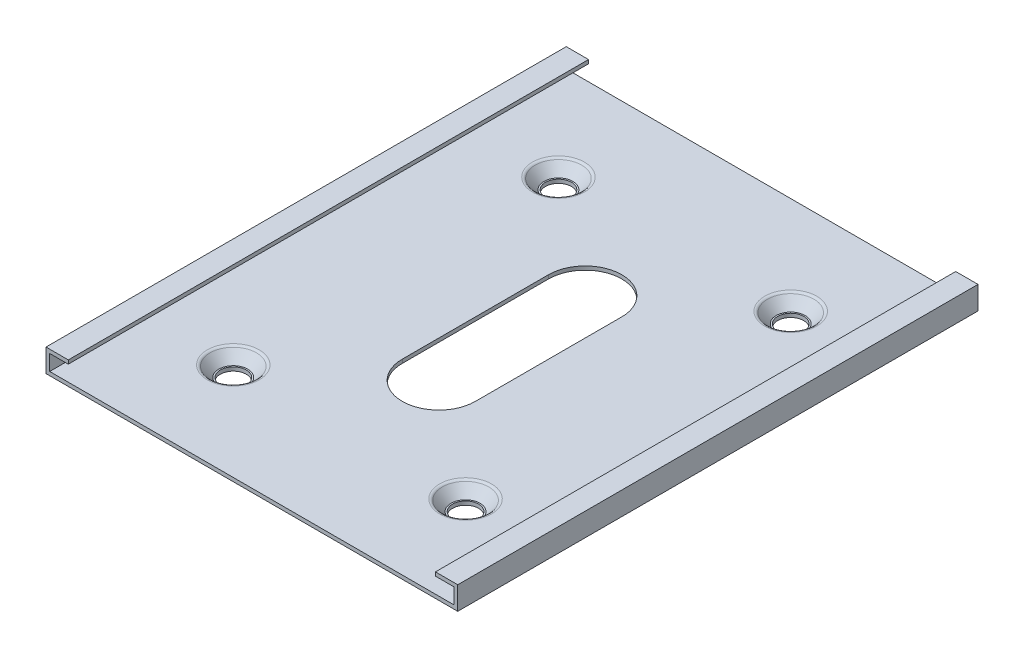
ISO-10303-21;
HEADER;
FILE_DESCRIPTION(('STEP AP214'),'2;1');
FILE_NAME('part.step','',(''),(''),'','','');
FILE_SCHEMA(('AUTOMOTIVE_DESIGN { 1 0 10303 214 1 1 1 1 }'));
ENDSEC;
DATA;
#1=APPLICATION_CONTEXT('core data for automotive mechanical design processes');
#2=APPLICATION_PROTOCOL_DEFINITION('international standard','automotive_design',2000,#1);
#3=PRODUCT_CONTEXT('',#1,'mechanical');
#4=PRODUCT('Part','Part','',(#3));
#5=PRODUCT_RELATED_PRODUCT_CATEGORY('part','',(#4));
#6=PRODUCT_DEFINITION_FORMATION('','',#4);
#7=PRODUCT_DEFINITION_CONTEXT('part definition',#1,'design');
#8=PRODUCT_DEFINITION('design','',#6,#7);
#9=PRODUCT_DEFINITION_SHAPE('','',#8);
#10=(LENGTH_UNIT() NAMED_UNIT(*) SI_UNIT(.MILLI.,.METRE.));
#11=(NAMED_UNIT(*) PLANE_ANGLE_UNIT() SI_UNIT($,.RADIAN.));
#12=(NAMED_UNIT(*) SI_UNIT($,.STERADIAN.) SOLID_ANGLE_UNIT());
#13=UNCERTAINTY_MEASURE_WITH_UNIT(LENGTH_MEASURE(1.E-05),#10,'distance_accuracy_value','');
#14=(GEOMETRIC_REPRESENTATION_CONTEXT(3) GLOBAL_UNCERTAINTY_ASSIGNED_CONTEXT((#13)) GLOBAL_UNIT_ASSIGNED_CONTEXT((#10,
#11,#12)) REPRESENTATION_CONTEXT('',''));
#15=CARTESIAN_POINT('',(0.,0.,0.));
#16=DIRECTION('',(0.,0.,1.));
#17=DIRECTION('',(1.,0.,0.));
#18=AXIS2_PLACEMENT_3D('',#15,#16,#17);
#19=CARTESIAN_POINT('',(-27.6352,2.13359999999999,35.56));
#20=DIRECTION('',(0.,1.,0.));
#21=DIRECTION('',(0.,0.,1.));
#22=AXIS2_PLACEMENT_3D('',#19,#20,#21);
#23=PLANE('',#22);
#24=DIRECTION('',(1.,0.,0.));
#25=VECTOR('',#24,1.);
#26=CARTESIAN_POINT('',(-27.6352,2.13359999999999,-35.56));
#27=LINE('',#26,#25);
#28=CARTESIAN_POINT('',(-27.6352,2.13359999999999,-35.56));
#29=VERTEX_POINT('',#28);
#30=CARTESIAN_POINT('',(-25.0952,2.13359999999999,-35.56));
#31=VERTEX_POINT('',#30);
#32=EDGE_CURVE('E173',#29,#31,#27,.T.);
#33=ORIENTED_EDGE('',*,*,#32,.T.);
#34=DIRECTION('',(0.,0.,-1.));
#35=VECTOR('',#34,1.);
#36=CARTESIAN_POINT('',(-25.0952,2.13359999999999,35.56));
#37=LINE('',#36,#35);
#38=CARTESIAN_POINT('',(-25.0952,2.13359999999999,35.56));
#39=VERTEX_POINT('',#38);
#40=EDGE_CURVE('E230',#39,#31,#37,.T.);
#41=ORIENTED_EDGE('',*,*,#40,.F.);
#42=DIRECTION('',(1.,0.,0.));
#43=VECTOR('',#42,1.);
#44=CARTESIAN_POINT('',(-27.6352,2.13359999999999,35.56));
#45=LINE('',#44,#43);
#46=CARTESIAN_POINT('',(-27.6352,2.13359999999999,35.56));
#47=VERTEX_POINT('',#46);
#48=EDGE_CURVE('E168',#47,#39,#45,.T.);
#49=ORIENTED_EDGE('',*,*,#48,.F.);
#50=DIRECTION('',(0.,0.,-1.));
#51=VECTOR('',#50,1.);
#52=CARTESIAN_POINT('',(-27.6352,2.13359999999999,35.56));
#53=LINE('',#52,#51);
#54=EDGE_CURVE('E163',#47,#29,#53,.T.);
#55=ORIENTED_EDGE('',*,*,#54,.T.);
#56=EDGE_LOOP('',(#33,#41,#49,#55));
#57=FACE_BOUND('',#56,.T.);
#58=ADVANCED_FACE('F33',(#57),#23,.F.);
#59=CARTESIAN_POINT('',(-25.0952,2.64159999999999,35.56));
#60=DIRECTION('',(1.,0.,0.));
#61=DIRECTION('',(0.,0.,-1.));
#62=AXIS2_PLACEMENT_3D('',#59,#60,#61);
#63=PLANE('',#62);
#64=DIRECTION('',(0.,-1.,0.));
#65=VECTOR('',#64,1.);
#66=CARTESIAN_POINT('',(-25.0952,2.64159999999999,-35.56));
#67=LINE('',#66,#65);
#68=CARTESIAN_POINT('',(-25.0952,2.64159999999999,-35.56));
#69=VERTEX_POINT('',#68);
#70=EDGE_CURVE('E180',#69,#31,#67,.T.);
#71=ORIENTED_EDGE('',*,*,#70,.F.);
#72=DIRECTION('',(0.,0.,-1.));
#73=VECTOR('',#72,1.);
#74=CARTESIAN_POINT('',(-25.0952,2.64159999999999,35.56));
#75=LINE('',#74,#73);
#76=CARTESIAN_POINT('',(-25.0952,2.64159999999999,35.56));
#77=VERTEX_POINT('',#76);
#78=EDGE_CURVE('E228',#77,#69,#75,.T.);
#79=ORIENTED_EDGE('',*,*,#78,.F.);
#80=DIRECTION('',(0.,-1.,0.));
#81=VECTOR('',#80,1.);
#82=CARTESIAN_POINT('',(-25.0952,2.64159999999999,35.56));
#83=LINE('',#82,#81);
#84=EDGE_CURVE('E319',#77,#39,#83,.T.);
#85=ORIENTED_EDGE('',*,*,#84,.T.);
#86=ORIENTED_EDGE('',*,*,#40,.T.);
#87=EDGE_LOOP('',(#71,#79,#85,#86));
#88=FACE_BOUND('',#87,.T.);
#89=ADVANCED_FACE('F350',(#88),#63,.T.);
#90=CARTESIAN_POINT('',(-27.6352,2.64159999999999,35.56));
#91=DIRECTION('',(0.,1.,0.));
#92=DIRECTION('',(0.,0.,1.));
#93=AXIS2_PLACEMENT_3D('',#90,#91,#92);
#94=PLANE('',#93);
#95=DIRECTION('',(1.,0.,0.));
#96=VECTOR('',#95,1.);
#97=CARTESIAN_POINT('',(-27.6352,2.64159999999999,-35.56));
#98=LINE('',#97,#96);
#99=CARTESIAN_POINT('',(-28.1432,2.64159999999999,-35.56));
#100=VERTEX_POINT('',#99);
#101=EDGE_CURVE('E183',#100,#69,#98,.T.);
#102=ORIENTED_EDGE('',*,*,#101,.F.);
#103=DIRECTION('',(0.,0.,-1.));
#104=VECTOR('',#103,1.);
#105=CARTESIAN_POINT('',(-28.1432,2.64159999999999,35.56));
#106=LINE('',#105,#104);
#107=CARTESIAN_POINT('',(-28.1432,2.64159999999999,35.56));
#108=VERTEX_POINT('',#107);
#109=EDGE_CURVE('E226',#108,#100,#106,.T.);
#110=ORIENTED_EDGE('',*,*,#109,.F.);
#111=DIRECTION('',(1.,0.,0.));
#112=VECTOR('',#111,1.);
#113=CARTESIAN_POINT('',(-27.6352,2.64159999999999,35.56));
#114=LINE('',#113,#112);
#115=EDGE_CURVE('E322',#108,#77,#114,.T.);
#116=ORIENTED_EDGE('',*,*,#115,.T.);
#117=ORIENTED_EDGE('',*,*,#78,.T.);
#118=EDGE_LOOP('',(#102,#110,#116,#117));
#119=FACE_BOUND('',#118,.T.);
#120=ADVANCED_FACE('F353',(#119),#94,.T.);
#121=CARTESIAN_POINT('',(-28.1432,0.,35.56));
#122=DIRECTION('',(-1.,0.,0.));
#123=DIRECTION('',(0.,0.,1.));
#124=AXIS2_PLACEMENT_3D('',#121,#122,#123);
#125=PLANE('',#124);
#126=DIRECTION('',(0.,1.,0.));
#127=VECTOR('',#126,1.);
#128=CARTESIAN_POINT('',(-28.1432,0.,-35.56));
#129=LINE('',#128,#127);
#130=CARTESIAN_POINT('',(-28.1432,-0.508,-35.56));
#131=VERTEX_POINT('',#130);
#132=EDGE_CURVE('E190',#131,#100,#129,.T.);
#133=ORIENTED_EDGE('',*,*,#132,.F.);
#134=DIRECTION('',(0.,0.,-1.));
#135=VECTOR('',#134,1.);
#136=CARTESIAN_POINT('',(-28.1432,-0.508,35.56));
#137=LINE('',#136,#135);
#138=CARTESIAN_POINT('',(-28.1432,-0.508,35.56));
#139=VERTEX_POINT('',#138);
#140=EDGE_CURVE('E224',#139,#131,#137,.T.);
#141=ORIENTED_EDGE('',*,*,#140,.F.);
#142=DIRECTION('',(0.,1.,0.));
#143=VECTOR('',#142,1.);
#144=CARTESIAN_POINT('',(-28.1432,0.,35.56));
#145=LINE('',#144,#143);
#146=EDGE_CURVE('E325',#139,#108,#145,.T.);
#147=ORIENTED_EDGE('',*,*,#146,.T.);
#148=ORIENTED_EDGE('',*,*,#109,.T.);
#149=EDGE_LOOP('',(#133,#141,#147,#148));
#150=FACE_BOUND('',#149,.T.);
#151=ADVANCED_FACE('F358',(#150),#125,.T.);
#152=CARTESIAN_POINT('',(27.6352,-0.508,35.56));
#153=DIRECTION('',(0.,-1.,0.));
#154=DIRECTION('',(0.,0.,-1.));
#155=AXIS2_PLACEMENT_3D('',#152,#153,#154);
#156=PLANE('',#155);
#157=CARTESIAN_POINT('',(15.875,-0.508,22.225));
#158=DIRECTION('',(0.,-1.,0.));
#159=DIRECTION('',(0.,0.,-1.));
#160=AXIS2_PLACEMENT_3D('',#157,#158,#159);
#161=CIRCLE('',#160,3.72761304322479);
#162=CARTESIAN_POINT('',(15.875,-0.508,18.4973869567752));
#163=VERTEX_POINT('',#162);
#164=EDGE_CURVE('E254',#163,#163,#161,.F.);
#165=ORIENTED_EDGE('',*,*,#164,.T.);
#166=EDGE_LOOP('',(#165));
#167=FACE_BOUND('',#166,.T.);
#168=CARTESIAN_POINT('',(-15.875,-0.508,-22.225));
#169=DIRECTION('',(0.,-1.,0.));
#170=DIRECTION('',(0.,0.,-1.));
#171=AXIS2_PLACEMENT_3D('',#168,#169,#170);
#172=CIRCLE('',#171,3.72761304322479);
#173=CARTESIAN_POINT('',(-15.875,-0.508,-25.9526130432248));
#174=VERTEX_POINT('',#173);
#175=EDGE_CURVE('E251',#174,#174,#172,.F.);
#176=ORIENTED_EDGE('',*,*,#175,.T.);
#177=EDGE_LOOP('',(#176));
#178=FACE_BOUND('',#177,.T.);
#179=CARTESIAN_POINT('',(15.875,-0.508,-22.225));
#180=DIRECTION('',(0.,-1.,0.));
#181=DIRECTION('',(0.,0.,-1.));
#182=AXIS2_PLACEMENT_3D('',#179,#180,#181);
#183=CIRCLE('',#182,3.72761304322479);
#184=CARTESIAN_POINT('',(15.875,-0.508,-25.9526130432248));
#185=VERTEX_POINT('',#184);
#186=EDGE_CURVE('E242',#185,#185,#183,.F.);
#187=ORIENTED_EDGE('',*,*,#186,.T.);
#188=EDGE_LOOP('',(#187));
#189=FACE_BOUND('',#188,.T.);
#190=CARTESIAN_POINT('',(-15.875,-0.508,22.225));
#191=DIRECTION('',(0.,-1.,0.));
#192=DIRECTION('',(0.,0.,-1.));
#193=AXIS2_PLACEMENT_3D('',#190,#191,#192);
#194=CIRCLE('',#193,3.52750652161239);
#195=CARTESIAN_POINT('',(-15.875,-0.508,18.6974934783876));
#196=VERTEX_POINT('',#195);
#197=EDGE_CURVE('E314',#196,#196,#194,.F.);
#198=ORIENTED_EDGE('',*,*,#197,.T.);
#199=EDGE_LOOP('',(#198));
#200=FACE_BOUND('',#199,.T.);
#201=CARTESIAN_POINT('',(0.,-0.508,10.));
#202=DIRECTION('',(0.,-1.,0.));
#203=DIRECTION('',(0.,0.,-1.));
#204=AXIS2_PLACEMENT_3D('',#201,#202,#203);
#205=CIRCLE('',#204,5.);
#206=CARTESIAN_POINT('',(4.99999999999999,-0.508,10.));
#207=VERTEX_POINT('',#206);
#208=CARTESIAN_POINT('',(-5.00000000000001,-0.508,10.));
#209=VERTEX_POINT('',#208);
#210=EDGE_CURVE('E181',#207,#209,#205,.T.);
#211=ORIENTED_EDGE('',*,*,#210,.F.);
#212=DIRECTION('',(0.,0.,-1.));
#213=VECTOR('',#212,1.);
#214=CARTESIAN_POINT('',(4.99999999999999,-0.508,10.));
#215=LINE('',#214,#213);
#216=CARTESIAN_POINT('',(5.00000000000002,-0.508,-10.));
#217=VERTEX_POINT('',#216);
#218=EDGE_CURVE('E77',#217,#207,#215,.F.);
#219=ORIENTED_EDGE('',*,*,#218,.F.);
#220=CARTESIAN_POINT('',(0.,-0.508,-10.));
#221=DIRECTION('',(0.,-1.,0.));
#222=DIRECTION('',(0.,0.,-1.));
#223=AXIS2_PLACEMENT_3D('',#220,#221,#222);
#224=CIRCLE('',#223,5.);
#225=CARTESIAN_POINT('',(-4.99999999999999,-0.508,-10.));
#226=VERTEX_POINT('',#225);
#227=EDGE_CURVE('E245',#226,#217,#224,.T.);
#228=ORIENTED_EDGE('',*,*,#227,.F.);
#229=DIRECTION('',(0.,0.,1.));
#230=VECTOR('',#229,1.);
#231=CARTESIAN_POINT('',(-5.00000000000001,-0.508,10.));
#232=LINE('',#231,#230);
#233=EDGE_CURVE('E243',#209,#226,#232,.F.);
#234=ORIENTED_EDGE('',*,*,#233,.F.);
#235=EDGE_LOOP('',(#211,#219,#228,#234));
#236=FACE_BOUND('',#235,.T.);
#237=DIRECTION('',(1.,0.,0.));
#238=VECTOR('',#237,1.);
#239=CARTESIAN_POINT('',(27.6352,-0.508,-35.56));
#240=LINE('',#239,#238);
#241=CARTESIAN_POINT('',(28.1432,-0.508,-35.56));
#242=VERTEX_POINT('',#241);
#243=EDGE_CURVE('E193',#242,#131,#240,.F.);
#244=ORIENTED_EDGE('',*,*,#243,.F.);
#245=DIRECTION('',(0.,0.,-1.));
#246=VECTOR('',#245,1.);
#247=CARTESIAN_POINT('',(28.1432,-0.508,35.56));
#248=LINE('',#247,#246);
#249=CARTESIAN_POINT('',(28.1432,-0.508,35.56));
#250=VERTEX_POINT('',#249);
#251=EDGE_CURVE('E222',#250,#242,#248,.T.);
#252=ORIENTED_EDGE('',*,*,#251,.F.);
#253=DIRECTION('',(1.,0.,0.));
#254=VECTOR('',#253,1.);
#255=CARTESIAN_POINT('',(27.6352,-0.508,35.56));
#256=LINE('',#255,#254);
#257=EDGE_CURVE('E328',#250,#139,#256,.F.);
#258=ORIENTED_EDGE('',*,*,#257,.T.);
#259=ORIENTED_EDGE('',*,*,#140,.T.);
#260=EDGE_LOOP('',(#244,#252,#258,#259));
#261=FACE_BOUND('',#260,.T.);
#262=ADVANCED_FACE('F361',(#167,#178,#189,#200,#236,#261),#156,.T.);
#263=CARTESIAN_POINT('',(28.1432,0.,35.56));
#264=DIRECTION('',(1.,0.,0.));
#265=DIRECTION('',(0.,0.,-1.));
#266=AXIS2_PLACEMENT_3D('',#263,#264,#265);
#267=PLANE('',#266);
#268=DIRECTION('',(0.,1.,0.));
#269=VECTOR('',#268,1.);
#270=CARTESIAN_POINT('',(28.1432,0.,-35.56));
#271=LINE('',#270,#269);
#272=CARTESIAN_POINT('',(28.1432,2.64159999999999,-35.56));
#273=VERTEX_POINT('',#272);
#274=EDGE_CURVE('E196',#273,#242,#271,.F.);
#275=ORIENTED_EDGE('',*,*,#274,.F.);
#276=DIRECTION('',(0.,0.,-1.));
#277=VECTOR('',#276,1.);
#278=CARTESIAN_POINT('',(28.1432,2.64159999999999,35.56));
#279=LINE('',#278,#277);
#280=CARTESIAN_POINT('',(28.1432,2.64159999999999,35.56));
#281=VERTEX_POINT('',#280);
#282=EDGE_CURVE('E220',#281,#273,#279,.T.);
#283=ORIENTED_EDGE('',*,*,#282,.F.);
#284=DIRECTION('',(0.,1.,0.));
#285=VECTOR('',#284,1.);
#286=CARTESIAN_POINT('',(28.1432,0.,35.56));
#287=LINE('',#286,#285);
#288=EDGE_CURVE('E331',#281,#250,#287,.F.);
#289=ORIENTED_EDGE('',*,*,#288,.T.);
#290=ORIENTED_EDGE('',*,*,#251,.T.);
#291=EDGE_LOOP('',(#275,#283,#289,#290));
#292=FACE_BOUND('',#291,.T.);
#293=ADVANCED_FACE('F366',(#292),#267,.T.);
#294=CARTESIAN_POINT('',(27.6352,2.64159999999999,35.56));
#295=DIRECTION('',(0.,1.,0.));
#296=DIRECTION('',(0.,0.,1.));
#297=AXIS2_PLACEMENT_3D('',#294,#295,#296);
#298=PLANE('',#297);
#299=DIRECTION('',(1.,0.,0.));
#300=VECTOR('',#299,1.);
#301=CARTESIAN_POINT('',(27.6352,2.64159999999999,-35.56));
#302=LINE('',#301,#300);
#303=CARTESIAN_POINT('',(25.0952,2.64159999999999,-35.56));
#304=VERTEX_POINT('',#303);
#305=EDGE_CURVE('E199',#304,#273,#302,.T.);
#306=ORIENTED_EDGE('',*,*,#305,.F.);
#307=DIRECTION('',(0.,0.,-1.));
#308=VECTOR('',#307,1.);
#309=CARTESIAN_POINT('',(25.0952,2.64159999999999,35.56));
#310=LINE('',#309,#308);
#311=CARTESIAN_POINT('',(25.0952,2.64159999999999,35.56));
#312=VERTEX_POINT('',#311);
#313=EDGE_CURVE('E218',#312,#304,#310,.T.);
#314=ORIENTED_EDGE('',*,*,#313,.F.);
#315=DIRECTION('',(1.,0.,0.));
#316=VECTOR('',#315,1.);
#317=CARTESIAN_POINT('',(27.6352,2.64159999999999,35.56));
#318=LINE('',#317,#316);
#319=EDGE_CURVE('E334',#312,#281,#318,.T.);
#320=ORIENTED_EDGE('',*,*,#319,.T.);
#321=ORIENTED_EDGE('',*,*,#282,.T.);
#322=EDGE_LOOP('',(#306,#314,#320,#321));
#323=FACE_BOUND('',#322,.T.);
#324=ADVANCED_FACE('F369',(#323),#298,.T.);
#325=CARTESIAN_POINT('',(25.0952,2.13359999999999,35.56));
#326=DIRECTION('',(-1.,0.,0.));
#327=DIRECTION('',(0.,0.,1.));
#328=AXIS2_PLACEMENT_3D('',#325,#326,#327);
#329=PLANE('',#328);
#330=DIRECTION('',(0.,1.,0.));
#331=VECTOR('',#330,1.);
#332=CARTESIAN_POINT('',(25.0952,2.13359999999999,-35.56));
#333=LINE('',#332,#331);
#334=CARTESIAN_POINT('',(25.0952,2.13359999999999,-35.56));
#335=VERTEX_POINT('',#334);
#336=EDGE_CURVE('E202',#335,#304,#333,.T.);
#337=ORIENTED_EDGE('',*,*,#336,.F.);
#338=DIRECTION('',(0.,0.,-1.));
#339=VECTOR('',#338,1.);
#340=CARTESIAN_POINT('',(25.0952,2.13359999999999,35.56));
#341=LINE('',#340,#339);
#342=CARTESIAN_POINT('',(25.0952,2.13359999999999,35.56));
#343=VERTEX_POINT('',#342);
#344=EDGE_CURVE('E216',#343,#335,#341,.T.);
#345=ORIENTED_EDGE('',*,*,#344,.F.);
#346=DIRECTION('',(0.,1.,0.));
#347=VECTOR('',#346,1.);
#348=CARTESIAN_POINT('',(25.0952,2.13359999999999,35.56));
#349=LINE('',#348,#347);
#350=EDGE_CURVE('E337',#343,#312,#349,.T.);
#351=ORIENTED_EDGE('',*,*,#350,.T.);
#352=ORIENTED_EDGE('',*,*,#313,.T.);
#353=EDGE_LOOP('',(#337,#345,#351,#352));
#354=FACE_BOUND('',#353,.T.);
#355=ADVANCED_FACE('F373',(#354),#329,.T.);
#356=CARTESIAN_POINT('',(27.6352,2.13359999999999,35.56));
#357=DIRECTION('',(0.,1.,0.));
#358=DIRECTION('',(0.,0.,1.));
#359=AXIS2_PLACEMENT_3D('',#356,#357,#358);
#360=PLANE('',#359);
#361=DIRECTION('',(1.,0.,0.));
#362=VECTOR('',#361,1.);
#363=CARTESIAN_POINT('',(27.6352,2.13359999999999,-35.56));
#364=LINE('',#363,#362);
#365=CARTESIAN_POINT('',(27.6352,2.13359999999999,-35.56));
#366=VERTEX_POINT('',#365);
#367=EDGE_CURVE('E205',#335,#366,#364,.T.);
#368=ORIENTED_EDGE('',*,*,#367,.T.);
#369=DIRECTION('',(0.,0.,-1.));
#370=VECTOR('',#369,1.);
#371=CARTESIAN_POINT('',(27.6352,2.13359999999999,35.56));
#372=LINE('',#371,#370);
#373=CARTESIAN_POINT('',(27.6352,2.13359999999999,35.56));
#374=VERTEX_POINT('',#373);
#375=EDGE_CURVE('E213',#374,#366,#372,.T.);
#376=ORIENTED_EDGE('',*,*,#375,.F.);
#377=DIRECTION('',(1.,0.,0.));
#378=VECTOR('',#377,1.);
#379=CARTESIAN_POINT('',(27.6352,2.13359999999999,35.56));
#380=LINE('',#379,#378);
#381=EDGE_CURVE('E340',#343,#374,#380,.T.);
#382=ORIENTED_EDGE('',*,*,#381,.F.);
#383=ORIENTED_EDGE('',*,*,#344,.T.);
#384=EDGE_LOOP('',(#368,#376,#382,#383));
#385=FACE_BOUND('',#384,.T.);
#386=ADVANCED_FACE('F378',(#385),#360,.F.);
#387=CARTESIAN_POINT('',(27.6352,0.,35.56));
#388=DIRECTION('',(1.,0.,0.));
#389=DIRECTION('',(0.,0.,-1.));
#390=AXIS2_PLACEMENT_3D('',#387,#388,#389);
#391=PLANE('',#390);
#392=DIRECTION('',(0.,-1.,0.));
#393=VECTOR('',#392,1.);
#394=CARTESIAN_POINT('',(27.6352,0.,-35.56));
#395=LINE('',#394,#393);
#396=CARTESIAN_POINT('',(27.6352,0.,-35.56));
#397=VERTEX_POINT('',#396);
#398=EDGE_CURVE('E207',#366,#397,#395,.T.);
#399=ORIENTED_EDGE('',*,*,#398,.T.);
#400=DIRECTION('',(0.,0.,-1.));
#401=VECTOR('',#400,1.);
#402=CARTESIAN_POINT('',(27.6352,0.,35.56));
#403=LINE('',#402,#401);
#404=CARTESIAN_POINT('',(27.6352,0.,35.56));
#405=VERTEX_POINT('',#404);
#406=EDGE_CURVE('E211',#405,#397,#403,.T.);
#407=ORIENTED_EDGE('',*,*,#406,.F.);
#408=DIRECTION('',(0.,-1.,0.));
#409=VECTOR('',#408,1.);
#410=CARTESIAN_POINT('',(27.6352,0.,35.56));
#411=LINE('',#410,#409);
#412=EDGE_CURVE('E342',#374,#405,#411,.T.);
#413=ORIENTED_EDGE('',*,*,#412,.F.);
#414=ORIENTED_EDGE('',*,*,#375,.T.);
#415=EDGE_LOOP('',(#399,#407,#413,#414));
#416=FACE_BOUND('',#415,.T.);
#417=ADVANCED_FACE('F298',(#416),#391,.F.);
#418=CARTESIAN_POINT('',(27.6352,0.,35.56));
#419=DIRECTION('',(0.,-1.,0.));
#420=DIRECTION('',(0.,0.,-1.));
#421=AXIS2_PLACEMENT_3D('',#418,#419,#420);
#422=PLANE('',#421);
#423=CARTESIAN_POINT('',(15.875,0.,-22.225));
#424=DIRECTION('',(0.,-1.,0.));
#425=DIRECTION('',(0.,0.,-1.));
#426=AXIS2_PLACEMENT_3D('',#423,#424,#425);
#427=CIRCLE('',#426,3.55357617213674);
#428=CARTESIAN_POINT('',(15.875,0.,-25.7785761721367));
#429=VERTEX_POINT('',#428);
#430=EDGE_CURVE('E275',#429,#429,#427,.T.);
#431=ORIENTED_EDGE('',*,*,#430,.T.);
#432=EDGE_LOOP('',(#431));
#433=FACE_BOUND('',#432,.T.);
#434=CARTESIAN_POINT('',(-15.875,0.,-22.225));
#435=DIRECTION('',(0.,-1.,0.));
#436=DIRECTION('',(0.,0.,-1.));
#437=AXIS2_PLACEMENT_3D('',#434,#435,#436);
#438=CIRCLE('',#437,3.55357617213674);
#439=CARTESIAN_POINT('',(-15.875,0.,-25.7785761721367));
#440=VERTEX_POINT('',#439);
#441=EDGE_CURVE('E272',#440,#440,#438,.T.);
#442=ORIENTED_EDGE('',*,*,#441,.T.);
#443=EDGE_LOOP('',(#442));
#444=FACE_BOUND('',#443,.T.);
#445=CARTESIAN_POINT('',(15.875,0.,22.225));
#446=DIRECTION('',(0.,-1.,0.));
#447=DIRECTION('',(0.,0.,-1.));
#448=AXIS2_PLACEMENT_3D('',#445,#446,#447);
#449=CIRCLE('',#448,3.55357617213674);
#450=CARTESIAN_POINT('',(15.875,0.,18.6714238278633));
#451=VERTEX_POINT('',#450);
#452=EDGE_CURVE('E269',#451,#451,#449,.T.);
#453=ORIENTED_EDGE('',*,*,#452,.T.);
#454=EDGE_LOOP('',(#453));
#455=FACE_BOUND('',#454,.T.);
#456=CARTESIAN_POINT('',(-15.875,0.,22.225));
#457=DIRECTION('',(0.,-1.,0.));
#458=DIRECTION('',(0.,0.,-1.));
#459=AXIS2_PLACEMENT_3D('',#456,#457,#458);
#460=CIRCLE('',#459,3.55357617213674);
#461=CARTESIAN_POINT('',(-15.875,0.,18.6714238278633));
#462=VERTEX_POINT('',#461);
#463=EDGE_CURVE('E266',#462,#462,#460,.T.);
#464=ORIENTED_EDGE('',*,*,#463,.T.);
#465=EDGE_LOOP('',(#464));
#466=FACE_BOUND('',#465,.T.);
#467=DIRECTION('',(0.,0.,1.));
#468=VECTOR('',#467,1.);
#469=CARTESIAN_POINT('',(4.99999999999997,0.,35.56));
#470=LINE('',#469,#468);
#471=CARTESIAN_POINT('',(5.00000000000002,0.,-10.));
#472=VERTEX_POINT('',#471);
#473=CARTESIAN_POINT('',(4.99999999999999,0.,10.));
#474=VERTEX_POINT('',#473);
#475=EDGE_CURVE('E238',#472,#474,#470,.T.);
#476=ORIENTED_EDGE('',*,*,#475,.T.);
#477=CARTESIAN_POINT('',(0.,0.,10.));
#478=DIRECTION('',(0.,-1.,0.));
#479=DIRECTION('',(0.,0.,-1.));
#480=AXIS2_PLACEMENT_3D('',#477,#478,#479);
#481=CIRCLE('',#480,5.);
#482=CARTESIAN_POINT('',(-5.00000000000001,0.,10.));
#483=VERTEX_POINT('',#482);
#484=EDGE_CURVE('E86',#474,#483,#481,.T.);
#485=ORIENTED_EDGE('',*,*,#484,.T.);
#486=DIRECTION('',(0.,0.,-1.));
#487=VECTOR('',#486,1.);
#488=CARTESIAN_POINT('',(-5.00000000000004,0.,35.56));
#489=LINE('',#488,#487);
#490=CARTESIAN_POINT('',(-4.99999999999999,0.,-10.));
#491=VERTEX_POINT('',#490);
#492=EDGE_CURVE('E232',#483,#491,#489,.T.);
#493=ORIENTED_EDGE('',*,*,#492,.T.);
#494=CARTESIAN_POINT('',(0.,0.,-10.));
#495=DIRECTION('',(0.,-1.,0.));
#496=DIRECTION('',(0.,0.,-1.));
#497=AXIS2_PLACEMENT_3D('',#494,#495,#496);
#498=CIRCLE('',#497,5.);
#499=EDGE_CURVE('E235',#491,#472,#498,.T.);
#500=ORIENTED_EDGE('',*,*,#499,.T.);
#501=EDGE_LOOP('',(#476,#485,#493,#500));
#502=FACE_BOUND('',#501,.T.);
#503=DIRECTION('',(-1.,0.,0.));
#504=VECTOR('',#503,1.);
#505=CARTESIAN_POINT('',(27.6352,0.,-35.56));
#506=LINE('',#505,#504);
#507=CARTESIAN_POINT('',(-27.6352,0.,-35.56));
#508=VERTEX_POINT('',#507);
#509=EDGE_CURVE('E153',#397,#508,#506,.T.);
#510=ORIENTED_EDGE('',*,*,#509,.T.);
#511=DIRECTION('',(0.,0.,-1.));
#512=VECTOR('',#511,1.);
#513=CARTESIAN_POINT('',(-27.6352,0.,35.56));
#514=LINE('',#513,#512);
#515=CARTESIAN_POINT('',(-27.6352,0.,35.56));
#516=VERTEX_POINT('',#515);
#517=EDGE_CURVE('E165',#516,#508,#514,.T.);
#518=ORIENTED_EDGE('',*,*,#517,.F.);
#519=DIRECTION('',(-1.,0.,0.));
#520=VECTOR('',#519,1.);
#521=CARTESIAN_POINT('',(27.6352,0.,35.56));
#522=LINE('',#521,#520);
#523=EDGE_CURVE('E343',#405,#516,#522,.T.);
#524=ORIENTED_EDGE('',*,*,#523,.F.);
#525=ORIENTED_EDGE('',*,*,#406,.T.);
#526=EDGE_LOOP('',(#510,#518,#524,#525));
#527=FACE_BOUND('',#526,.T.);
#528=ADVANCED_FACE('F295',(#433,#444,#455,#466,#502,#527),#422,.F.);
#529=CARTESIAN_POINT('',(-27.6352,0.,35.56));
#530=DIRECTION('',(-1.,0.,0.));
#531=DIRECTION('',(0.,0.,1.));
#532=AXIS2_PLACEMENT_3D('',#529,#530,#531);
#533=PLANE('',#532);
#534=DIRECTION('',(0.,1.,0.));
#535=VECTOR('',#534,1.);
#536=CARTESIAN_POINT('',(-27.6352,0.,-35.56));
#537=LINE('',#536,#535);
#538=EDGE_CURVE('E159',#508,#29,#537,.T.);
#539=ORIENTED_EDGE('',*,*,#538,.T.);
#540=ORIENTED_EDGE('',*,*,#54,.F.);
#541=DIRECTION('',(0.,1.,0.));
#542=VECTOR('',#541,1.);
#543=CARTESIAN_POINT('',(-27.6352,0.,35.56));
#544=LINE('',#543,#542);
#545=EDGE_CURVE('E175',#516,#47,#544,.T.);
#546=ORIENTED_EDGE('',*,*,#545,.F.);
#547=ORIENTED_EDGE('',*,*,#517,.T.);
#548=EDGE_LOOP('',(#539,#540,#546,#547));
#549=FACE_BOUND('',#548,.T.);
#550=ADVANCED_FACE('F161',(#549),#533,.F.);
#551=CARTESIAN_POINT('',(0.,0.,35.56));
#552=DIRECTION('',(0.,0.,-1.));
#553=DIRECTION('',(-1.,0.,0.));
#554=AXIS2_PLACEMENT_3D('',#551,#552,#553);
#555=PLANE('',#554);
#556=ORIENTED_EDGE('',*,*,#48,.T.);
#557=ORIENTED_EDGE('',*,*,#84,.F.);
#558=ORIENTED_EDGE('',*,*,#115,.F.);
#559=ORIENTED_EDGE('',*,*,#146,.F.);
#560=ORIENTED_EDGE('',*,*,#257,.F.);
#561=ORIENTED_EDGE('',*,*,#288,.F.);
#562=ORIENTED_EDGE('',*,*,#319,.F.);
#563=ORIENTED_EDGE('',*,*,#350,.F.);
#564=ORIENTED_EDGE('',*,*,#381,.T.);
#565=ORIENTED_EDGE('',*,*,#412,.T.);
#566=ORIENTED_EDGE('',*,*,#523,.T.);
#567=ORIENTED_EDGE('',*,*,#545,.T.);
#568=EDGE_LOOP('',(#556,#557,#558,#559,#560,#561,#562,#563,#564,#565,#566,#567));
#569=FACE_BOUND('',#568,.T.);
#570=ADVANCED_FACE('F346',(#569),#555,.F.);
#571=CARTESIAN_POINT('',(0.,0.,-35.56));
#572=DIRECTION('',(0.,0.,-1.));
#573=DIRECTION('',(-1.,0.,0.));
#574=AXIS2_PLACEMENT_3D('',#571,#572,#573);
#575=PLANE('',#574);
#576=ORIENTED_EDGE('',*,*,#32,.F.);
#577=ORIENTED_EDGE('',*,*,#538,.F.);
#578=ORIENTED_EDGE('',*,*,#509,.F.);
#579=ORIENTED_EDGE('',*,*,#398,.F.);
#580=ORIENTED_EDGE('',*,*,#367,.F.);
#581=ORIENTED_EDGE('',*,*,#336,.T.);
#582=ORIENTED_EDGE('',*,*,#305,.T.);
#583=ORIENTED_EDGE('',*,*,#274,.T.);
#584=ORIENTED_EDGE('',*,*,#243,.T.);
#585=ORIENTED_EDGE('',*,*,#132,.T.);
#586=ORIENTED_EDGE('',*,*,#101,.T.);
#587=ORIENTED_EDGE('',*,*,#70,.T.);
#588=EDGE_LOOP('',(#576,#577,#578,#579,#580,#581,#582,#583,#584,#585,#586,#587));
#589=FACE_BOUND('',#588,.T.);
#590=ADVANCED_FACE('F177',(#589),#575,.T.);
#591=CARTESIAN_POINT('',(0.,2.64159999999999,10.));
#592=DIRECTION('',(0.,-1.,0.));
#593=DIRECTION('',(0.,0.,-1.));
#594=AXIS2_PLACEMENT_3D('',#591,#592,#593);
#595=CYLINDRICAL_SURFACE('',#594,5.);
#596=ORIENTED_EDGE('',*,*,#210,.T.);
#597=DIRECTION('',(0.,-1.,0.));
#598=VECTOR('',#597,1.);
#599=CARTESIAN_POINT('',(-5.00000000000001,2.64159999999999,10.));
#600=LINE('',#599,#598);
#601=EDGE_CURVE('E48',#483,#209,#600,.T.);
#602=ORIENTED_EDGE('',*,*,#601,.F.);
#603=ORIENTED_EDGE('',*,*,#484,.F.);
#604=DIRECTION('',(0.,-1.,0.));
#605=VECTOR('',#604,1.);
#606=CARTESIAN_POINT('',(4.99999999999999,2.64159999999999,10.));
#607=LINE('',#606,#605);
#608=EDGE_CURVE('E246',#474,#207,#607,.T.);
#609=ORIENTED_EDGE('',*,*,#608,.T.);
#610=EDGE_LOOP('',(#596,#602,#603,#609));
#611=FACE_BOUND('',#610,.T.);
#612=ADVANCED_FACE('F506',(#611),#595,.F.);
#613=CARTESIAN_POINT('',(4.99999999999999,2.64159999999999,10.));
#614=DIRECTION('',(1.,0.,0.));
#615=DIRECTION('',(0.,0.,-1.));
#616=AXIS2_PLACEMENT_3D('',#613,#614,#615);
#617=PLANE('',#616);
#618=ORIENTED_EDGE('',*,*,#218,.T.);
#619=ORIENTED_EDGE('',*,*,#608,.F.);
#620=ORIENTED_EDGE('',*,*,#475,.F.);
#621=DIRECTION('',(0.,-1.,0.));
#622=VECTOR('',#621,1.);
#623=CARTESIAN_POINT('',(5.00000000000002,2.64159999999999,-10.));
#624=LINE('',#623,#622);
#625=EDGE_CURVE('E306',#472,#217,#624,.T.);
#626=ORIENTED_EDGE('',*,*,#625,.T.);
#627=EDGE_LOOP('',(#618,#619,#620,#626));
#628=FACE_BOUND('',#627,.T.);
#629=ADVANCED_FACE('F305',(#628),#617,.F.);
#630=CARTESIAN_POINT('',(0.,2.64159999999999,-10.));
#631=DIRECTION('',(0.,-1.,0.));
#632=DIRECTION('',(0.,0.,-1.));
#633=AXIS2_PLACEMENT_3D('',#630,#631,#632);
#634=CYLINDRICAL_SURFACE('',#633,5.);
#635=ORIENTED_EDGE('',*,*,#227,.T.);
#636=ORIENTED_EDGE('',*,*,#625,.F.);
#637=ORIENTED_EDGE('',*,*,#499,.F.);
#638=DIRECTION('',(0.,-1.,0.));
#639=VECTOR('',#638,1.);
#640=CARTESIAN_POINT('',(-4.99999999999999,2.64159999999999,-10.));
#641=LINE('',#640,#639);
#642=EDGE_CURVE('E54',#491,#226,#641,.T.);
#643=ORIENTED_EDGE('',*,*,#642,.T.);
#644=EDGE_LOOP('',(#635,#636,#637,#643));
#645=FACE_BOUND('',#644,.T.);
#646=ADVANCED_FACE('F308',(#645),#634,.F.);
#647=CARTESIAN_POINT('',(-5.00000000000001,2.64159999999999,10.));
#648=DIRECTION('',(-1.,0.,0.));
#649=DIRECTION('',(0.,0.,1.));
#650=AXIS2_PLACEMENT_3D('',#647,#648,#649);
#651=PLANE('',#650);
#652=ORIENTED_EDGE('',*,*,#233,.T.);
#653=ORIENTED_EDGE('',*,*,#642,.F.);
#654=ORIENTED_EDGE('',*,*,#492,.F.);
#655=ORIENTED_EDGE('',*,*,#601,.T.);
#656=EDGE_LOOP('',(#652,#653,#654,#655));
#657=FACE_BOUND('',#656,.T.);
#658=ADVANCED_FACE('F503',(#657),#651,.F.);
#659=CARTESIAN_POINT('',(15.875,0.,22.225));
#660=DIRECTION('',(0.,1.,0.));
#661=DIRECTION('',(0.,0.,-1.));
#662=AXIS2_PLACEMENT_3D('',#659,#660,#661);
#663=CONICAL_SURFACE('',#662,3.3274,0.73303828583762);
#664=CARTESIAN_POINT('',(15.875,-0.1680816519697,22.225));
#665=DIRECTION('',(0.,1.,0.));
#666=DIRECTION('',(0.,0.,1.));
#667=AXIS2_PLACEMENT_3D('',#664,#665,#666);
#668=CIRCLE('',#667,3.17605860079422);
#669=CARTESIAN_POINT('',(15.875,-0.1680816519697,25.4010586007942));
#670=VERTEX_POINT('',#669);
#671=EDGE_CURVE('E41',#670,#670,#668,.T.);
#672=ORIENTED_EDGE('',*,*,#671,.T.);
#673=EDGE_LOOP('',(#672));
#674=FACE_BOUND('',#673,.T.);
#675=CARTESIAN_POINT('',(15.875,-1.4986,22.225));
#676=DIRECTION('',(0.,1.,0.));
#677=DIRECTION('',(0.,0.,1.));
#678=AXIS2_PLACEMENT_3D('',#675,#676,#677);
#679=CIRCLE('',#678,1.97805449921525);
#680=CARTESIAN_POINT('',(15.875,-1.4986,24.2030544992153));
#681=VERTEX_POINT('',#680);
#682=EDGE_CURVE('E450',#681,#681,#679,.T.);
#683=ORIENTED_EDGE('',*,*,#682,.F.);
#684=EDGE_LOOP('',(#683));
#685=FACE_BOUND('',#684,.T.);
#686=ADVANCED_FACE('F286',(#674,#685),#663,.F.);
#687=CARTESIAN_POINT('',(-15.875,0.,22.225));
#688=DIRECTION('',(0.,1.,0.));
#689=DIRECTION('',(0.,0.,-1.));
#690=AXIS2_PLACEMENT_3D('',#687,#688,#689);
#691=CONICAL_SURFACE('',#690,3.3274,0.73303828583762);
#692=CARTESIAN_POINT('',(-15.875,-0.1680816519697,22.225));
#693=DIRECTION('',(0.,1.,0.));
#694=DIRECTION('',(0.,0.,1.));
#695=AXIS2_PLACEMENT_3D('',#692,#693,#694);
#696=CIRCLE('',#695,3.17605860079422);
#697=CARTESIAN_POINT('',(-15.875,-0.1680816519697,25.4010586007942));
#698=VERTEX_POINT('',#697);
#699=EDGE_CURVE('E11',#698,#698,#696,.T.);
#700=ORIENTED_EDGE('',*,*,#699,.T.);
#701=EDGE_LOOP('',(#700));
#702=FACE_BOUND('',#701,.T.);
#703=CARTESIAN_POINT('',(-15.875,-1.4986,22.225));
#704=DIRECTION('',(0.,1.,0.));
#705=DIRECTION('',(0.,0.,1.));
#706=AXIS2_PLACEMENT_3D('',#703,#704,#705);
#707=CIRCLE('',#706,1.97805449921525);
#708=CARTESIAN_POINT('',(-15.875,-1.4986,24.2030544992153));
#709=VERTEX_POINT('',#708);
#710=EDGE_CURVE('E461',#709,#709,#707,.T.);
#711=ORIENTED_EDGE('',*,*,#710,.F.);
#712=EDGE_LOOP('',(#711));
#713=FACE_BOUND('',#712,.T.);
#714=ADVANCED_FACE('F428',(#702,#713),#691,.F.);
#715=CARTESIAN_POINT('',(-15.875,0.,-22.225));
#716=DIRECTION('',(0.,1.,0.));
#717=DIRECTION('',(0.,0.,-1.));
#718=AXIS2_PLACEMENT_3D('',#715,#716,#717);
#719=CONICAL_SURFACE('',#718,3.3274,0.73303828583762);
#720=CARTESIAN_POINT('',(-15.875,-0.1680816519697,-22.225));
#721=DIRECTION('',(0.,1.,0.));
#722=DIRECTION('',(0.,0.,1.));
#723=AXIS2_PLACEMENT_3D('',#720,#721,#722);
#724=CIRCLE('',#723,3.17605860079422);
#725=CARTESIAN_POINT('',(-15.875,-0.1680816519697,-19.0489413992058));
#726=VERTEX_POINT('',#725);
#727=EDGE_CURVE('E281',#726,#726,#724,.T.);
#728=ORIENTED_EDGE('',*,*,#727,.T.);
#729=EDGE_LOOP('',(#728));
#730=FACE_BOUND('',#729,.T.);
#731=CARTESIAN_POINT('',(-15.875,-1.4986,-22.225));
#732=DIRECTION('',(0.,1.,0.));
#733=DIRECTION('',(0.,0.,1.));
#734=AXIS2_PLACEMENT_3D('',#731,#732,#733);
#735=CIRCLE('',#734,1.97805449921525);
#736=CARTESIAN_POINT('',(-15.875,-1.4986,-20.2469455007847));
#737=VERTEX_POINT('',#736);
#738=EDGE_CURVE('E432',#737,#737,#735,.T.);
#739=ORIENTED_EDGE('',*,*,#738,.F.);
#740=EDGE_LOOP('',(#739));
#741=FACE_BOUND('',#740,.T.);
#742=ADVANCED_FACE('F424',(#730,#741),#719,.F.);
#743=CARTESIAN_POINT('',(15.875,0.,-22.225));
#744=DIRECTION('',(0.,1.,0.));
#745=DIRECTION('',(0.,0.,-1.));
#746=AXIS2_PLACEMENT_3D('',#743,#744,#745);
#747=CONICAL_SURFACE('',#746,3.3274,0.73303828583762);
#748=CARTESIAN_POINT('',(15.875,-0.1680816519697,-22.225));
#749=DIRECTION('',(0.,1.,0.));
#750=DIRECTION('',(0.,0.,1.));
#751=AXIS2_PLACEMENT_3D('',#748,#749,#750);
#752=CIRCLE('',#751,3.17605860079422);
#753=CARTESIAN_POINT('',(15.875,-0.1680816519697,-19.0489413992058));
#754=VERTEX_POINT('',#753);
#755=EDGE_CURVE('E278',#754,#754,#752,.T.);
#756=ORIENTED_EDGE('',*,*,#755,.T.);
#757=EDGE_LOOP('',(#756));
#758=FACE_BOUND('',#757,.T.);
#759=CARTESIAN_POINT('',(15.875,-1.4986,-22.225));
#760=DIRECTION('',(0.,1.,0.));
#761=DIRECTION('',(0.,0.,1.));
#762=AXIS2_PLACEMENT_3D('',#759,#760,#761);
#763=CIRCLE('',#762,1.97805449921525);
#764=CARTESIAN_POINT('',(15.875,-1.4986,-20.2469455007847));
#765=VERTEX_POINT('',#764);
#766=EDGE_CURVE('E885',#765,#765,#763,.T.);
#767=ORIENTED_EDGE('',*,*,#766,.F.);
#768=EDGE_LOOP('',(#767));
#769=FACE_BOUND('',#768,.T.);
#770=ADVANCED_FACE('F427',(#758,#769),#747,.F.);
#771=CARTESIAN_POINT('',(-15.875,-1.4986,24.2030544992153));
#772=DIRECTION('',(0.,-1.,0.));
#773=DIRECTION('',(0.,0.,-1.));
#774=AXIS2_PLACEMENT_3D('',#771,#772,#773);
#775=PLANE('',#774);
#776=CARTESIAN_POINT('',(-15.875,-1.4986,22.225));
#777=DIRECTION('',(0.,1.,0.));
#778=DIRECTION('',(0.,0.,1.));
#779=AXIS2_PLACEMENT_3D('',#776,#777,#778);
#780=CIRCLE('',#779,1.778);
#781=CARTESIAN_POINT('',(-15.875,-1.4986,24.003));
#782=VERTEX_POINT('',#781);
#783=EDGE_CURVE('E459',#782,#782,#780,.T.);
#784=ORIENTED_EDGE('',*,*,#783,.F.);
#785=EDGE_LOOP('',(#784));
#786=FACE_BOUND('',#785,.T.);
#787=ORIENTED_EDGE('',*,*,#710,.T.);
#788=EDGE_LOOP('',(#787));
#789=FACE_BOUND('',#788,.T.);
#790=ADVANCED_FACE('F486',(#786,#789),#775,.F.);
#791=CARTESIAN_POINT('',(-15.875,8.98957727785579,22.225));
#792=DIRECTION('',(0.,1.,0.));
#793=DIRECTION('',(0.,0.,1.));
#794=AXIS2_PLACEMENT_3D('',#791,#792,#793);
#795=CYLINDRICAL_SURFACE('',#794,1.778);
#796=CARTESIAN_POINT('',(-15.875,-2.0066,22.225));
#797=DIRECTION('',(0.,1.,0.));
#798=DIRECTION('',(0.,0.,1.));
#799=AXIS2_PLACEMENT_3D('',#796,#797,#798);
#800=CIRCLE('',#799,1.778);
#801=CARTESIAN_POINT('',(-15.875,-2.0066,24.003));
#802=VERTEX_POINT('',#801);
#803=EDGE_CURVE('E456',#802,#802,#800,.T.);
#804=ORIENTED_EDGE('',*,*,#803,.F.);
#805=EDGE_LOOP('',(#804));
#806=FACE_BOUND('',#805,.T.);
#807=ORIENTED_EDGE('',*,*,#783,.T.);
#808=EDGE_LOOP('',(#807));
#809=FACE_BOUND('',#808,.T.);
#810=ADVANCED_FACE('F480',(#806,#809),#795,.F.);
#811=CARTESIAN_POINT('',(-15.875,-2.0066,24.003));
#812=DIRECTION('',(0.,1.,0.));
#813=DIRECTION('',(0.,0.,1.));
#814=AXIS2_PLACEMENT_3D('',#811,#812,#813);
#815=PLANE('',#814);
#816=CARTESIAN_POINT('',(-15.875,-2.0066,22.225));
#817=DIRECTION('',(0.,1.,0.));
#818=DIRECTION('',(0.,0.,1.));
#819=AXIS2_PLACEMENT_3D('',#816,#817,#818);
#820=CIRCLE('',#819,1.92045477276942);
#821=CARTESIAN_POINT('',(-15.875,-2.0066,24.1454547727694));
#822=VERTEX_POINT('',#821);
#823=EDGE_CURVE('E453',#822,#822,#820,.T.);
#824=ORIENTED_EDGE('',*,*,#823,.F.);
#825=EDGE_LOOP('',(#824));
#826=FACE_BOUND('',#825,.T.);
#827=ORIENTED_EDGE('',*,*,#803,.T.);
#828=EDGE_LOOP('',(#827));
#829=FACE_BOUND('',#828,.T.);
#830=ADVANCED_FACE('F474',(#826,#829),#815,.F.);
#831=CARTESIAN_POINT('',(-15.875,-2.0066,22.225));
#832=DIRECTION('',(0.,1.,0.));
#833=DIRECTION('',(0.,0.,1.));
#834=AXIS2_PLACEMENT_3D('',#831,#832,#833);
#835=CONICAL_SURFACE('',#834,1.92045477276942,0.82030474843733);
#836=ORIENTED_EDGE('',*,*,#197,.F.);
#837=EDGE_LOOP('',(#836));
#838=FACE_BOUND('',#837,.T.);
#839=ORIENTED_EDGE('',*,*,#823,.T.);
#840=EDGE_LOOP('',(#839));
#841=FACE_BOUND('',#840,.T.);
#842=ADVANCED_FACE('F470',(#838,#841),#835,.T.);
#843=CARTESIAN_POINT('',(15.875,-1.4986,24.2030544992153));
#844=DIRECTION('',(0.,-1.,0.));
#845=DIRECTION('',(0.,0.,-1.));
#846=AXIS2_PLACEMENT_3D('',#843,#844,#845);
#847=PLANE('',#846);
#848=CARTESIAN_POINT('',(15.875,-1.4986,22.225));
#849=DIRECTION('',(0.,1.,0.));
#850=DIRECTION('',(0.,0.,1.));
#851=AXIS2_PLACEMENT_3D('',#848,#849,#850);
#852=CIRCLE('',#851,1.778);
#853=CARTESIAN_POINT('',(15.875,-1.4986,24.003));
#854=VERTEX_POINT('',#853);
#855=EDGE_CURVE('E447',#854,#854,#852,.T.);
#856=ORIENTED_EDGE('',*,*,#855,.F.);
#857=EDGE_LOOP('',(#856));
#858=FACE_BOUND('',#857,.T.);
#859=ORIENTED_EDGE('',*,*,#682,.T.);
#860=EDGE_LOOP('',(#859));
#861=FACE_BOUND('',#860,.T.);
#862=ADVANCED_FACE('F473',(#858,#861),#847,.F.);
#863=CARTESIAN_POINT('',(15.875,8.98957727785579,22.225));
#864=DIRECTION('',(0.,1.,0.));
#865=DIRECTION('',(0.,0.,1.));
#866=AXIS2_PLACEMENT_3D('',#863,#864,#865);
#867=CYLINDRICAL_SURFACE('',#866,1.778);
#868=CARTESIAN_POINT('',(15.875,-2.0066,22.225));
#869=DIRECTION('',(0.,1.,0.));
#870=DIRECTION('',(0.,0.,1.));
#871=AXIS2_PLACEMENT_3D('',#868,#869,#870);
#872=CIRCLE('',#871,1.778);
#873=CARTESIAN_POINT('',(15.875,-2.0066,24.003));
#874=VERTEX_POINT('',#873);
#875=EDGE_CURVE('E438',#874,#874,#872,.T.);
#876=ORIENTED_EDGE('',*,*,#875,.F.);
#877=EDGE_LOOP('',(#876));
#878=FACE_BOUND('',#877,.T.);
#879=ORIENTED_EDGE('',*,*,#855,.T.);
#880=EDGE_LOOP('',(#879));
#881=FACE_BOUND('',#880,.T.);
#882=ADVANCED_FACE('F705',(#878,#881),#867,.F.);
#883=CARTESIAN_POINT('',(15.875,-2.0066,24.003));
#884=DIRECTION('',(0.,1.,0.));
#885=DIRECTION('',(0.,0.,1.));
#886=AXIS2_PLACEMENT_3D('',#883,#884,#885);
#887=PLANE('',#886);
#888=CARTESIAN_POINT('',(15.875,-2.0066,22.225));
#889=DIRECTION('',(0.,1.,0.));
#890=DIRECTION('',(0.,0.,1.));
#891=AXIS2_PLACEMENT_3D('',#888,#889,#890);
#892=CIRCLE('',#891,1.92045477276942);
#893=CARTESIAN_POINT('',(15.875,-2.0066,24.1454547727694));
#894=VERTEX_POINT('',#893);
#895=EDGE_CURVE('E434',#894,#894,#892,.T.);
#896=ORIENTED_EDGE('',*,*,#895,.F.);
#897=EDGE_LOOP('',(#896));
#898=FACE_BOUND('',#897,.T.);
#899=ORIENTED_EDGE('',*,*,#875,.T.);
#900=EDGE_LOOP('',(#899));
#901=FACE_BOUND('',#900,.T.);
#902=ADVANCED_FACE('F575',(#898,#901),#887,.F.);
#903=CARTESIAN_POINT('',(15.875,-2.0066,22.225));
#904=DIRECTION('',(0.,1.,0.));
#905=DIRECTION('',(0.,0.,1.));
#906=AXIS2_PLACEMENT_3D('',#903,#904,#905);
#907=CONICAL_SURFACE('',#906,1.92045477276942,0.82030474843733);
#908=CARTESIAN_POINT('',(15.875,-0.644472319577463,22.225));
#909=DIRECTION('',(0.,-1.,0.));
#910=DIRECTION('',(0.,0.,-1.));
#911=AXIS2_PLACEMENT_3D('',#908,#909,#910);
#912=CIRCLE('',#911,3.38115787631304);
#913=CARTESIAN_POINT('',(15.875,-0.644472319577463,18.843842123687));
#914=VERTEX_POINT('',#913);
#915=EDGE_CURVE('E257',#914,#914,#912,.T.);
#916=ORIENTED_EDGE('',*,*,#915,.T.);
#917=EDGE_LOOP('',(#916));
#918=FACE_BOUND('',#917,.T.);
#919=ORIENTED_EDGE('',*,*,#895,.T.);
#920=EDGE_LOOP('',(#919));
#921=FACE_BOUND('',#920,.T.);
#922=ADVANCED_FACE('F569',(#918,#921),#907,.T.);
#923=CARTESIAN_POINT('',(-15.875,-1.4986,-20.2469455007847));
#924=DIRECTION('',(0.,-1.,0.));
#925=DIRECTION('',(0.,0.,-1.));
#926=AXIS2_PLACEMENT_3D('',#923,#924,#925);
#927=PLANE('',#926);
#928=CARTESIAN_POINT('',(-15.875,-1.4986,-22.225));
#929=DIRECTION('',(0.,1.,0.));
#930=DIRECTION('',(0.,0.,1.));
#931=AXIS2_PLACEMENT_3D('',#928,#929,#930);
#932=CIRCLE('',#931,1.778);
#933=CARTESIAN_POINT('',(-15.875,-1.4986,-20.447));
#934=VERTEX_POINT('',#933);
#935=EDGE_CURVE('E435',#934,#934,#932,.T.);
#936=ORIENTED_EDGE('',*,*,#935,.F.);
#937=EDGE_LOOP('',(#936));
#938=FACE_BOUND('',#937,.T.);
#939=ORIENTED_EDGE('',*,*,#738,.T.);
#940=EDGE_LOOP('',(#939));
#941=FACE_BOUND('',#940,.T.);
#942=ADVANCED_FACE('F574',(#938,#941),#927,.F.);
#943=CARTESIAN_POINT('',(-15.875,8.98957727785579,-22.225));
#944=DIRECTION('',(0.,1.,0.));
#945=DIRECTION('',(0.,0.,1.));
#946=AXIS2_PLACEMENT_3D('',#943,#944,#945);
#947=CYLINDRICAL_SURFACE('',#946,1.778);
#948=CARTESIAN_POINT('',(-15.875,-2.0066,-22.225));
#949=DIRECTION('',(0.,1.,0.));
#950=DIRECTION('',(0.,0.,1.));
#951=AXIS2_PLACEMENT_3D('',#948,#949,#950);
#952=CIRCLE('',#951,1.778);
#953=CARTESIAN_POINT('',(-15.875,-2.0066,-20.447));
#954=VERTEX_POINT('',#953);
#955=EDGE_CURVE('E441',#954,#954,#952,.T.);
#956=ORIENTED_EDGE('',*,*,#955,.F.);
#957=EDGE_LOOP('',(#956));
#958=FACE_BOUND('',#957,.T.);
#959=ORIENTED_EDGE('',*,*,#935,.T.);
#960=EDGE_LOOP('',(#959));
#961=FACE_BOUND('',#960,.T.);
#962=ADVANCED_FACE('F681',(#958,#961),#947,.F.);
#963=CARTESIAN_POINT('',(-15.875,-2.0066,-20.447));
#964=DIRECTION('',(0.,1.,0.));
#965=DIRECTION('',(0.,0.,1.));
#966=AXIS2_PLACEMENT_3D('',#963,#964,#965);
#967=PLANE('',#966);
#968=CARTESIAN_POINT('',(-15.875,-2.0066,-22.225));
#969=DIRECTION('',(0.,1.,0.));
#970=DIRECTION('',(0.,0.,1.));
#971=AXIS2_PLACEMENT_3D('',#968,#969,#970);
#972=CIRCLE('',#971,1.92045477276942);
#973=CARTESIAN_POINT('',(-15.875,-2.0066,-20.3045452272306));
#974=VERTEX_POINT('',#973);
#975=EDGE_CURVE('E883',#974,#974,#972,.T.);
#976=ORIENTED_EDGE('',*,*,#975,.F.);
#977=EDGE_LOOP('',(#976));
#978=FACE_BOUND('',#977,.T.);
#979=ORIENTED_EDGE('',*,*,#955,.T.);
#980=EDGE_LOOP('',(#979));
#981=FACE_BOUND('',#980,.T.);
#982=ADVANCED_FACE('F591',(#978,#981),#967,.F.);
#983=CARTESIAN_POINT('',(-15.875,-2.0066,-22.225));
#984=DIRECTION('',(0.,1.,0.));
#985=DIRECTION('',(0.,0.,1.));
#986=AXIS2_PLACEMENT_3D('',#983,#984,#985);
#987=CONICAL_SURFACE('',#986,1.92045477276942,0.82030474843733);
#988=CARTESIAN_POINT('',(-15.875,-0.644472319577463,-22.225));
#989=DIRECTION('',(0.,-1.,0.));
#990=DIRECTION('',(0.,0.,-1.));
#991=AXIS2_PLACEMENT_3D('',#988,#989,#990);
#992=CIRCLE('',#991,3.38115787631304);
#993=CARTESIAN_POINT('',(-15.875,-0.644472319577463,-25.606157876313));
#994=VERTEX_POINT('',#993);
#995=EDGE_CURVE('E260',#994,#994,#992,.T.);
#996=ORIENTED_EDGE('',*,*,#995,.T.);
#997=EDGE_LOOP('',(#996));
#998=FACE_BOUND('',#997,.T.);
#999=ORIENTED_EDGE('',*,*,#975,.T.);
#1000=EDGE_LOOP('',(#999));
#1001=FACE_BOUND('',#1000,.T.);
#1002=ADVANCED_FACE('F585',(#998,#1001),#987,.T.);
#1003=CARTESIAN_POINT('',(15.875,-1.4986,-20.2469455007847));
#1004=DIRECTION('',(0.,-1.,0.));
#1005=DIRECTION('',(0.,0.,-1.));
#1006=AXIS2_PLACEMENT_3D('',#1003,#1004,#1005);
#1007=PLANE('',#1006);
#1008=CARTESIAN_POINT('',(15.875,-1.4986,-22.225));
#1009=DIRECTION('',(0.,1.,0.));
#1010=DIRECTION('',(0.,0.,1.));
#1011=AXIS2_PLACEMENT_3D('',#1008,#1009,#1010);
#1012=CIRCLE('',#1011,1.778);
#1013=CARTESIAN_POINT('',(15.875,-1.4986,-20.447));
#1014=VERTEX_POINT('',#1013);
#1015=EDGE_CURVE('E890',#1014,#1014,#1012,.T.);
#1016=ORIENTED_EDGE('',*,*,#1015,.F.);
#1017=EDGE_LOOP('',(#1016));
#1018=FACE_BOUND('',#1017,.T.);
#1019=ORIENTED_EDGE('',*,*,#766,.T.);
#1020=EDGE_LOOP('',(#1019));
#1021=FACE_BOUND('',#1020,.T.);
#1022=ADVANCED_FACE('F590',(#1018,#1021),#1007,.F.);
#1023=CARTESIAN_POINT('',(15.875,8.98957727785579,-22.225));
#1024=DIRECTION('',(0.,1.,0.));
#1025=DIRECTION('',(0.,0.,1.));
#1026=AXIS2_PLACEMENT_3D('',#1023,#1024,#1025);
#1027=CYLINDRICAL_SURFACE('',#1026,1.778);
#1028=CARTESIAN_POINT('',(15.875,-2.0066,-22.225));
#1029=DIRECTION('',(0.,1.,0.));
#1030=DIRECTION('',(0.,0.,1.));
#1031=AXIS2_PLACEMENT_3D('',#1028,#1029,#1030);
#1032=CIRCLE('',#1031,1.778);
#1033=CARTESIAN_POINT('',(15.875,-2.0066,-20.447));
#1034=VERTEX_POINT('',#1033);
#1035=EDGE_CURVE('E893',#1034,#1034,#1032,.T.);
#1036=ORIENTED_EDGE('',*,*,#1035,.F.);
#1037=EDGE_LOOP('',(#1036));
#1038=FACE_BOUND('',#1037,.T.);
#1039=ORIENTED_EDGE('',*,*,#1015,.T.);
#1040=EDGE_LOOP('',(#1039));
#1041=FACE_BOUND('',#1040,.T.);
#1042=ADVANCED_FACE('F660',(#1038,#1041),#1027,.F.);
#1043=CARTESIAN_POINT('',(15.875,-2.0066,-20.447));
#1044=DIRECTION('',(0.,1.,0.));
#1045=DIRECTION('',(0.,0.,1.));
#1046=AXIS2_PLACEMENT_3D('',#1043,#1044,#1045);
#1047=PLANE('',#1046);
#1048=CARTESIAN_POINT('',(15.875,-2.0066,-22.225));
#1049=DIRECTION('',(0.,1.,0.));
#1050=DIRECTION('',(0.,0.,1.));
#1051=AXIS2_PLACEMENT_3D('',#1048,#1049,#1050);
#1052=CIRCLE('',#1051,1.92045477276942);
#1053=CARTESIAN_POINT('',(15.875,-2.0066,-20.3045452272306));
#1054=VERTEX_POINT('',#1053);
#1055=EDGE_CURVE('E896',#1054,#1054,#1052,.T.);
#1056=ORIENTED_EDGE('',*,*,#1055,.F.);
#1057=EDGE_LOOP('',(#1056));
#1058=FACE_BOUND('',#1057,.T.);
#1059=ORIENTED_EDGE('',*,*,#1035,.T.);
#1060=EDGE_LOOP('',(#1059));
#1061=FACE_BOUND('',#1060,.T.);
#1062=ADVANCED_FACE('F605',(#1058,#1061),#1047,.F.);
#1063=CARTESIAN_POINT('',(15.875,-2.0066,-22.225));
#1064=DIRECTION('',(0.,1.,0.));
#1065=DIRECTION('',(0.,0.,1.));
#1066=AXIS2_PLACEMENT_3D('',#1063,#1064,#1065);
#1067=CONICAL_SURFACE('',#1066,1.92045477276942,0.82030474843733);
#1068=CARTESIAN_POINT('',(15.875,-0.644472319577463,-22.225));
#1069=DIRECTION('',(0.,-1.,0.));
#1070=DIRECTION('',(0.,0.,-1.));
#1071=AXIS2_PLACEMENT_3D('',#1068,#1069,#1070);
#1072=CIRCLE('',#1071,3.38115787631304);
#1073=CARTESIAN_POINT('',(15.875,-0.644472319577463,-25.606157876313));
#1074=VERTEX_POINT('',#1073);
#1075=EDGE_CURVE('E263',#1074,#1074,#1072,.T.);
#1076=ORIENTED_EDGE('',*,*,#1075,.T.);
#1077=EDGE_LOOP('',(#1076));
#1078=FACE_BOUND('',#1077,.T.);
#1079=ORIENTED_EDGE('',*,*,#1055,.T.);
#1080=EDGE_LOOP('',(#1079));
#1081=FACE_BOUND('',#1080,.T.);
#1082=ADVANCED_FACE('F402',(#1078,#1081),#1067,.T.);
#1083=CARTESIAN_POINT('',(15.875,-1.016,22.225));
#1084=DIRECTION('',(0.,-1.,0.));
#1085=DIRECTION('',(0.,0.,-1.));
#1086=AXIS2_PLACEMENT_3D('',#1083,#1084,#1085);
#1087=TOROIDAL_SURFACE('',#1086,3.72761304322479,0.508);
#1088=ORIENTED_EDGE('',*,*,#915,.F.);
#1089=EDGE_LOOP('',(#1088));
#1090=FACE_BOUND('',#1089,.T.);
#1091=ORIENTED_EDGE('',*,*,#164,.F.);
#1092=EDGE_LOOP('',(#1091));
#1093=FACE_BOUND('',#1092,.T.);
#1094=ADVANCED_FACE('F398',(#1090,#1093),#1087,.F.);
#1095=CARTESIAN_POINT('',(-15.875,-1.016,-22.225));
#1096=DIRECTION('',(0.,-1.,0.));
#1097=DIRECTION('',(0.,0.,-1.));
#1098=AXIS2_PLACEMENT_3D('',#1095,#1096,#1097);
#1099=TOROIDAL_SURFACE('',#1098,3.72761304322479,0.508);
#1100=ORIENTED_EDGE('',*,*,#995,.F.);
#1101=EDGE_LOOP('',(#1100));
#1102=FACE_BOUND('',#1101,.T.);
#1103=ORIENTED_EDGE('',*,*,#175,.F.);
#1104=EDGE_LOOP('',(#1103));
#1105=FACE_BOUND('',#1104,.T.);
#1106=ADVANCED_FACE('F401',(#1102,#1105),#1099,.F.);
#1107=CARTESIAN_POINT('',(15.875,-1.016,-22.225));
#1108=DIRECTION('',(0.,-1.,0.));
#1109=DIRECTION('',(0.,0.,-1.));
#1110=AXIS2_PLACEMENT_3D('',#1107,#1108,#1109);
#1111=TOROIDAL_SURFACE('',#1110,3.72761304322479,0.508);
#1112=ORIENTED_EDGE('',*,*,#1075,.F.);
#1113=EDGE_LOOP('',(#1112));
#1114=FACE_BOUND('',#1113,.T.);
#1115=ORIENTED_EDGE('',*,*,#186,.F.);
#1116=EDGE_LOOP('',(#1115));
#1117=FACE_BOUND('',#1116,.T.);
#1118=ADVANCED_FACE('F406',(#1114,#1117),#1111,.F.);
#1119=CARTESIAN_POINT('',(15.875,-0.508,-22.225));
#1120=DIRECTION('',(0.,-1.,0.));
#1121=DIRECTION('',(0.,0.,-1.));
#1122=AXIS2_PLACEMENT_3D('',#1119,#1120,#1121);
#1123=TOROIDAL_SURFACE('',#1122,3.55357617213674,0.508);
#1124=ORIENTED_EDGE('',*,*,#755,.F.);
#1125=EDGE_LOOP('',(#1124));
#1126=FACE_BOUND('',#1125,.T.);
#1127=ORIENTED_EDGE('',*,*,#430,.F.);
#1128=EDGE_LOOP('',(#1127));
#1129=FACE_BOUND('',#1128,.T.);
#1130=ADVANCED_FACE('F410',(#1126,#1129),#1123,.T.);
#1131=CARTESIAN_POINT('',(-15.875,-0.508,-22.225));
#1132=DIRECTION('',(0.,-1.,0.));
#1133=DIRECTION('',(0.,0.,-1.));
#1134=AXIS2_PLACEMENT_3D('',#1131,#1132,#1133);
#1135=TOROIDAL_SURFACE('',#1134,3.55357617213674,0.508);
#1136=ORIENTED_EDGE('',*,*,#727,.F.);
#1137=EDGE_LOOP('',(#1136));
#1138=FACE_BOUND('',#1137,.T.);
#1139=ORIENTED_EDGE('',*,*,#441,.F.);
#1140=EDGE_LOOP('',(#1139));
#1141=FACE_BOUND('',#1140,.T.);
#1142=ADVANCED_FACE('F292',(#1138,#1141),#1135,.T.);
#1143=CARTESIAN_POINT('',(15.875,-0.508,22.225));
#1144=DIRECTION('',(0.,-1.,0.));
#1145=DIRECTION('',(0.,0.,-1.));
#1146=AXIS2_PLACEMENT_3D('',#1143,#1144,#1145);
#1147=TOROIDAL_SURFACE('',#1146,3.55357617213674,0.508);
#1148=ORIENTED_EDGE('',*,*,#671,.F.);
#1149=EDGE_LOOP('',(#1148));
#1150=FACE_BOUND('',#1149,.T.);
#1151=ORIENTED_EDGE('',*,*,#452,.F.);
#1152=EDGE_LOOP('',(#1151));
#1153=FACE_BOUND('',#1152,.T.);
#1154=ADVANCED_FACE('F289',(#1150,#1153),#1147,.T.);
#1155=CARTESIAN_POINT('',(-15.875,-0.508,22.225));
#1156=DIRECTION('',(0.,-1.,0.));
#1157=DIRECTION('',(0.,0.,-1.));
#1158=AXIS2_PLACEMENT_3D('',#1155,#1156,#1157);
#1159=TOROIDAL_SURFACE('',#1158,3.55357617213674,0.508);
#1160=ORIENTED_EDGE('',*,*,#699,.F.);
#1161=EDGE_LOOP('',(#1160));
#1162=FACE_BOUND('',#1161,.T.);
#1163=ORIENTED_EDGE('',*,*,#463,.F.);
#1164=EDGE_LOOP('',(#1163));
#1165=FACE_BOUND('',#1164,.T.);
#1166=ADVANCED_FACE('F35',(#1162,#1165),#1159,.T.);
#1167=CLOSED_SHELL('',(#58,#89,#120,#151,#262,#293,#324,#355,#386,#417,#528,#550,#570,#590,#612,
#629,#646,#658,#686,#714,#742,#770,#790,#810,#830,#842,#862,#882,#902,#922,#942,#962,#982,#1002,
#1022,#1042,#1062,#1082,#1094,#1106,#1118,#1130,#1142,#1154,#1166));
#1168=MANIFOLD_SOLID_BREP('B2',#1167);
#1169=ADVANCED_BREP_SHAPE_REPRESENTATION('',(#18,#1168),#14);
#1170=SHAPE_DEFINITION_REPRESENTATION(#9,#1169);
ENDSEC;
END-ISO-10303-21;
